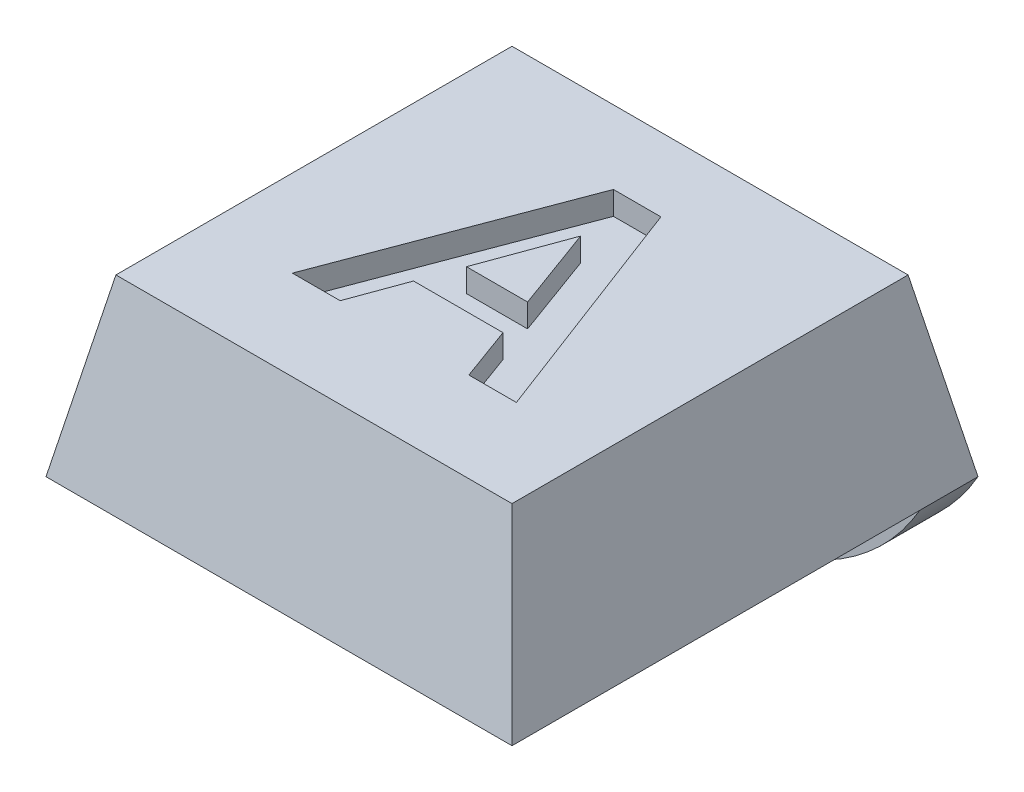
ISO-10303-21;
HEADER;
FILE_DESCRIPTION(('STEP AP214'),'2;1');
FILE_NAME('part.step','',(''),(''),'','','');
FILE_SCHEMA(('AUTOMOTIVE_DESIGN { 1 0 10303 214 1 1 1 1 }'));
ENDSEC;
DATA;
#1=APPLICATION_CONTEXT('core data for automotive mechanical design processes');
#2=APPLICATION_PROTOCOL_DEFINITION('international standard','automotive_design',2000,#1);
#3=PRODUCT_CONTEXT('',#1,'mechanical');
#4=PRODUCT('Part','Part','',(#3));
#5=PRODUCT_RELATED_PRODUCT_CATEGORY('part','',(#4));
#6=PRODUCT_DEFINITION_FORMATION('','',#4);
#7=PRODUCT_DEFINITION_CONTEXT('part definition',#1,'design');
#8=PRODUCT_DEFINITION('design','',#6,#7);
#9=PRODUCT_DEFINITION_SHAPE('','',#8);
#10=(LENGTH_UNIT() NAMED_UNIT(*) SI_UNIT(.MILLI.,.METRE.));
#11=(NAMED_UNIT(*) PLANE_ANGLE_UNIT() SI_UNIT($,.RADIAN.));
#12=(NAMED_UNIT(*) SI_UNIT($,.STERADIAN.) SOLID_ANGLE_UNIT());
#13=UNCERTAINTY_MEASURE_WITH_UNIT(LENGTH_MEASURE(1.E-05),#10,'distance_accuracy_value','');
#14=(GEOMETRIC_REPRESENTATION_CONTEXT(3) GLOBAL_UNCERTAINTY_ASSIGNED_CONTEXT((#13)) GLOBAL_UNIT_ASSIGNED_CONTEXT((#10,
#11,#12)) REPRESENTATION_CONTEXT('',''));
#15=CARTESIAN_POINT('',(0.,0.,0.));
#16=DIRECTION('',(0.,0.,1.));
#17=DIRECTION('',(1.,0.,0.));
#18=AXIS2_PLACEMENT_3D('',#15,#16,#17);
#19=CARTESIAN_POINT('',(0.,3.,0.));
#20=DIRECTION('',(0.,-1.,0.));
#21=DIRECTION('',(0.,0.,-1.));
#22=AXIS2_PLACEMENT_3D('',#19,#20,#21);
#23=PLANE('',#22);
#24=DIRECTION('',(-1.,0.,0.));
#25=VECTOR('',#24,1.);
#26=CARTESIAN_POINT('',(11.,3.,-0.6));
#27=LINE('',#26,#25);
#28=CARTESIAN_POINT('',(7.4,3.,-0.6));
#29=VERTEX_POINT('',#28);
#30=CARTESIAN_POINT('',(0.6,3.,-0.6));
#31=VERTEX_POINT('',#30);
#32=EDGE_CURVE('E314',#29,#31,#27,.T.);
#33=ORIENTED_EDGE('',*,*,#32,.F.);
#34=DIRECTION('',(0.,0.,1.));
#35=VECTOR('',#34,1.);
#36=CARTESIAN_POINT('',(7.4,3.,-8.));
#37=LINE('',#36,#35);
#38=CARTESIAN_POINT('',(7.4,3.,-7.4));
#39=VERTEX_POINT('',#38);
#40=EDGE_CURVE('E327',#39,#29,#37,.T.);
#41=ORIENTED_EDGE('',*,*,#40,.F.);
#42=DIRECTION('',(-1.,0.,0.));
#43=VECTOR('',#42,1.);
#44=CARTESIAN_POINT('',(11.,3.,-7.4));
#45=LINE('',#44,#43);
#46=CARTESIAN_POINT('',(0.599999999999999,3.,-7.4));
#47=VERTEX_POINT('',#46);
#48=EDGE_CURVE('E310',#39,#47,#45,.T.);
#49=ORIENTED_EDGE('',*,*,#48,.T.);
#50=DIRECTION('',(0.,0.,1.));
#51=VECTOR('',#50,1.);
#52=CARTESIAN_POINT('',(0.6,3.,-8.));
#53=LINE('',#52,#51);
#54=EDGE_CURVE('E330',#47,#31,#53,.T.);
#55=ORIENTED_EDGE('',*,*,#54,.T.);
#56=EDGE_LOOP('',(#33,#41,#49,#55));
#57=FACE_BOUND('',#56,.T.);
#58=DIRECTION('',(0.355060662326772,0.,0.934843262835045));
#59=VECTOR('',#58,1.);
#60=CARTESIAN_POINT('',(4.41462653323797,3.,-6.14165206843505));
#61=LINE('',#60,#59);
#62=CARTESIAN_POINT('',(4.41462653323797,3.,-6.14165206843505));
#63=VERTEX_POINT('',#62);
#64=CARTESIAN_POINT('',(5.93385730246874,3.,-2.14165206843505));
#65=VERTEX_POINT('',#64);
#66=EDGE_CURVE('E58',#63,#65,#61,.T.);
#67=ORIENTED_EDGE('',*,*,#66,.T.);
#68=DIRECTION('',(-1.,0.,0.));
#69=VECTOR('',#68,1.);
#70=CARTESIAN_POINT('',(5.93385730246874,3.,-2.14165206843505));
#71=LINE('',#70,#69);
#72=CARTESIAN_POINT('',(5.11815217426361,3.,-2.14165206843505));
#73=VERTEX_POINT('',#72);
#74=EDGE_CURVE('E239',#65,#73,#71,.T.);
#75=ORIENTED_EDGE('',*,*,#74,.T.);
#76=DIRECTION('',(-0.343248282132193,0.,-0.939244705501872));
#77=VECTOR('',#76,1.);
#78=CARTESIAN_POINT('',(5.11815217426361,3.,-2.14165206843505));
#79=LINE('',#78,#77);
#80=CARTESIAN_POINT('',(4.78081243067387,3.,-3.06472899151198));
#81=VERTEX_POINT('',#80);
#82=EDGE_CURVE('E243',#73,#81,#79,.T.);
#83=ORIENTED_EDGE('',*,*,#82,.T.);
#84=DIRECTION('',(-1.,0.,0.));
#85=VECTOR('',#84,1.);
#86=CARTESIAN_POINT('',(4.78081243067387,3.,-3.06472899151198));
#87=LINE('',#86,#85);
#88=CARTESIAN_POINT('',(3.24555602041746,3.,-3.06472899151198));
#89=VERTEX_POINT('',#88);
#90=EDGE_CURVE('E247',#81,#89,#87,.T.);
#91=ORIENTED_EDGE('',*,*,#90,.T.);
#92=DIRECTION('',(-0.343248282132194,0.,0.939244705501872));
#93=VECTOR('',#92,1.);
#94=CARTESIAN_POINT('',(3.24555602041746,3.,-3.06472899151198));
#95=LINE('',#94,#93);
#96=CARTESIAN_POINT('',(2.90821627682771,3.,-2.14165206843505));
#97=VERTEX_POINT('',#96);
#98=EDGE_CURVE('E251',#89,#97,#95,.T.);
#99=ORIENTED_EDGE('',*,*,#98,.T.);
#100=DIRECTION('',(-1.,0.,0.));
#101=VECTOR('',#100,1.);
#102=CARTESIAN_POINT('',(2.90821627682771,3.,-2.14165206843505));
#103=LINE('',#102,#101);
#104=CARTESIAN_POINT('',(2.08770345631489,3.,-2.14165206843505));
#105=VERTEX_POINT('',#104);
#106=EDGE_CURVE('E255',#97,#105,#103,.T.);
#107=ORIENTED_EDGE('',*,*,#106,.T.);
#108=DIRECTION('',(0.353586403368764,0.,-0.935401868371419));
#109=VECTOR('',#108,1.);
#110=CARTESIAN_POINT('',(2.08770345631489,3.,-2.14165206843505));
#111=LINE('',#110,#109);
#112=CARTESIAN_POINT('',(3.59972268708412,3.,-6.14165206843505));
#113=VERTEX_POINT('',#112);
#114=EDGE_CURVE('E259',#105,#113,#111,.T.);
#115=ORIENTED_EDGE('',*,*,#114,.T.);
#116=DIRECTION('',(1.,0.,0.));
#117=VECTOR('',#116,1.);
#118=CARTESIAN_POINT('',(3.59972268708412,3.,-6.14165206843505));
#119=LINE('',#118,#117);
#120=EDGE_CURVE('E215',#113,#63,#119,.T.);
#121=ORIENTED_EDGE('',*,*,#120,.T.);
#122=EDGE_LOOP('',(#67,#75,#83,#91,#99,#107,#115,#121));
#123=FACE_BOUND('',#122,.T.);
#124=ADVANCED_FACE('F42',(#57,#123),#23,.F.);
#125=CARTESIAN_POINT('',(8.,0.,-8.));
#126=DIRECTION('',(-0.98058067569092,-0.196116135138184,0.));
#127=DIRECTION('',(0.196116135138184,-0.98058067569092,0.));
#128=AXIS2_PLACEMENT_3D('',#125,#126,#127);
#129=PLANE('',#128);
#130=DIRECTION('',(-0.192450089729875,0.962250448649376,-0.192450089729875));
#131=VECTOR('',#130,1.);
#132=CARTESIAN_POINT('',(7.7037037037037,1.48148148148148,-0.296296296296296));
#133=LINE('',#132,#131);
#134=CARTESIAN_POINT('',(8.,0.,0.));
#135=VERTEX_POINT('',#134);
#136=EDGE_CURVE('E324',#135,#29,#133,.T.);
#137=ORIENTED_EDGE('',*,*,#136,.F.);
#138=DIRECTION('',(0.,0.,-1.));
#139=VECTOR('',#138,1.);
#140=CARTESIAN_POINT('',(8.,0.,0.));
#141=LINE('',#140,#139);
#142=CARTESIAN_POINT('',(8.,0.,-7.));
#143=VERTEX_POINT('',#142);
#144=EDGE_CURVE('E343',#135,#143,#141,.T.);
#145=ORIENTED_EDGE('',*,*,#144,.T.);
#146=DIRECTION('',(0.,0.,1.));
#147=VECTOR('',#146,1.);
#148=CARTESIAN_POINT('',(8.,0.,-8.));
#149=LINE('',#148,#147);
#150=CARTESIAN_POINT('',(8.,0.,-8.));
#151=VERTEX_POINT('',#150);
#152=EDGE_CURVE('E289',#151,#143,#149,.T.);
#153=ORIENTED_EDGE('',*,*,#152,.F.);
#154=DIRECTION('',(0.192450089729875,-0.962250448649376,-0.192450089729875));
#155=VECTOR('',#154,1.);
#156=CARTESIAN_POINT('',(8.,0.,-8.));
#157=LINE('',#156,#155);
#158=EDGE_CURVE('E317',#39,#151,#157,.T.);
#159=ORIENTED_EDGE('',*,*,#158,.F.);
#160=ORIENTED_EDGE('',*,*,#40,.T.);
#161=EDGE_LOOP('',(#137,#145,#153,#159,#160));
#162=FACE_BOUND('',#161,.T.);
#163=ADVANCED_FACE('F416',(#162),#129,.F.);
#164=CARTESIAN_POINT('',(0.,0.,-8.));
#165=DIRECTION('',(0.98058067569092,-0.196116135138184,0.));
#166=DIRECTION('',(0.196116135138184,0.98058067569092,0.));
#167=AXIS2_PLACEMENT_3D('',#164,#165,#166);
#168=PLANE('',#167);
#169=DIRECTION('',(-0.192450089729875,-0.962250448649376,0.192450089729875));
#170=VECTOR('',#169,1.);
#171=CARTESIAN_POINT('',(0.296296296296296,1.48148148148148,-0.296296296296296));
#172=LINE('',#171,#170);
#173=CARTESIAN_POINT('',(0.,0.,0.));
#174=VERTEX_POINT('',#173);
#175=EDGE_CURVE('E371',#31,#174,#172,.T.);
#176=ORIENTED_EDGE('',*,*,#175,.F.);
#177=ORIENTED_EDGE('',*,*,#54,.F.);
#178=DIRECTION('',(0.192450089729875,0.962250448649376,0.192450089729875));
#179=VECTOR('',#178,1.);
#180=CARTESIAN_POINT('',(0.,0.,-8.));
#181=LINE('',#180,#179);
#182=CARTESIAN_POINT('',(0.,0.,-8.));
#183=VERTEX_POINT('',#182);
#184=EDGE_CURVE('E342',#183,#47,#181,.T.);
#185=ORIENTED_EDGE('',*,*,#184,.F.);
#186=DIRECTION('',(0.,0.,1.));
#187=VECTOR('',#186,1.);
#188=CARTESIAN_POINT('',(0.,0.,0.));
#189=LINE('',#188,#187);
#190=CARTESIAN_POINT('',(0.,0.,-7.));
#191=VERTEX_POINT('',#190);
#192=EDGE_CURVE('E347',#183,#191,#189,.T.);
#193=ORIENTED_EDGE('',*,*,#192,.T.);
#194=EDGE_CURVE('E334',#191,#174,#189,.T.);
#195=ORIENTED_EDGE('',*,*,#194,.T.);
#196=EDGE_LOOP('',(#176,#177,#185,#193,#195));
#197=FACE_BOUND('',#196,.T.);
#198=ADVANCED_FACE('F396',(#197),#168,.F.);
#199=CARTESIAN_POINT('',(0.,0.,0.));
#200=DIRECTION('',(0.,-1.,0.));
#201=DIRECTION('',(0.,0.,-1.));
#202=AXIS2_PLACEMENT_3D('',#199,#200,#201);
#203=PLANE('',#202);
#204=DIRECTION('',(-1.,0.,0.));
#205=VECTOR('',#204,1.);
#206=CARTESIAN_POINT('',(0.,0.,-7.));
#207=LINE('',#206,#205);
#208=EDGE_CURVE('E295',#143,#191,#207,.T.);
#209=ORIENTED_EDGE('',*,*,#208,.F.);
#210=ORIENTED_EDGE('',*,*,#144,.F.);
#211=DIRECTION('',(1.,0.,0.));
#212=VECTOR('',#211,1.);
#213=CARTESIAN_POINT('',(0.,0.,0.));
#214=LINE('',#213,#212);
#215=EDGE_CURVE('E344',#174,#135,#214,.T.);
#216=ORIENTED_EDGE('',*,*,#215,.F.);
#217=ORIENTED_EDGE('',*,*,#194,.F.);
#218=EDGE_LOOP('',(#209,#210,#216,#217));
#219=FACE_BOUND('',#218,.T.);
#220=CARTESIAN_POINT('',(4.,0.,-3.75));
#221=DIRECTION('',(0.,-1.,0.));
#222=DIRECTION('',(0.,0.,-1.));
#223=AXIS2_PLACEMENT_3D('',#220,#221,#222);
#224=CIRCLE('',#223,1.8);
#225=CARTESIAN_POINT('',(4.,0.,-5.55));
#226=VERTEX_POINT('',#225);
#227=EDGE_CURVE('E299',#226,#226,#224,.T.);
#228=ORIENTED_EDGE('',*,*,#227,.F.);
#229=EDGE_LOOP('',(#228));
#230=FACE_BOUND('',#229,.T.);
#231=ADVANCED_FACE('F411',(#219,#230),#203,.T.);
#232=CARTESIAN_POINT('',(11.,3.,-7.4));
#233=DIRECTION('',(0.,0.196116135138184,-0.98058067569092));
#234=DIRECTION('',(0.,0.98058067569092,0.196116135138184));
#235=AXIS2_PLACEMENT_3D('',#232,#233,#234);
#236=PLANE('',#235);
#237=ORIENTED_EDGE('',*,*,#158,.T.);
#238=DIRECTION('',(-1.,0.,0.));
#239=VECTOR('',#238,1.);
#240=CARTESIAN_POINT('',(0.,0.,-8.));
#241=LINE('',#240,#239);
#242=EDGE_CURVE('E338',#151,#183,#241,.T.);
#243=ORIENTED_EDGE('',*,*,#242,.T.);
#244=ORIENTED_EDGE('',*,*,#184,.T.);
#245=ORIENTED_EDGE('',*,*,#48,.F.);
#246=EDGE_LOOP('',(#237,#243,#244,#245));
#247=FACE_BOUND('',#246,.T.);
#248=ADVANCED_FACE('F391',(#247),#236,.T.);
#249=CARTESIAN_POINT('',(11.,0.,0.));
#250=DIRECTION('',(0.,0.196116135138184,0.98058067569092));
#251=DIRECTION('',(0.,-0.98058067569092,0.196116135138184));
#252=AXIS2_PLACEMENT_3D('',#249,#250,#251);
#253=PLANE('',#252);
#254=ORIENTED_EDGE('',*,*,#136,.T.);
#255=ORIENTED_EDGE('',*,*,#32,.T.);
#256=ORIENTED_EDGE('',*,*,#175,.T.);
#257=ORIENTED_EDGE('',*,*,#215,.T.);
#258=EDGE_LOOP('',(#254,#255,#256,#257));
#259=FACE_BOUND('',#258,.T.);
#260=ADVANCED_FACE('F420',(#259),#253,.T.);
#261=CARTESIAN_POINT('',(4.,0.8,-3.75));
#262=DIRECTION('',(0.,-1.,0.));
#263=DIRECTION('',(0.,0.,-1.));
#264=AXIS2_PLACEMENT_3D('',#261,#262,#263);
#265=CYLINDRICAL_SURFACE('',#264,1.8);
#266=CARTESIAN_POINT('',(4.,0.8,-3.75));
#267=DIRECTION('',(0.,-1.,0.));
#268=DIRECTION('',(0.,0.,-1.));
#269=AXIS2_PLACEMENT_3D('',#266,#267,#268);
#270=CIRCLE('',#269,1.8);
#271=CARTESIAN_POINT('',(4.,0.8,-5.55));
#272=VERTEX_POINT('',#271);
#273=EDGE_CURVE('E306',#272,#272,#270,.T.);
#274=ORIENTED_EDGE('',*,*,#273,.F.);
#275=EDGE_LOOP('',(#274));
#276=FACE_BOUND('',#275,.T.);
#277=ORIENTED_EDGE('',*,*,#227,.T.);
#278=EDGE_LOOP('',(#277));
#279=FACE_BOUND('',#278,.T.);
#280=ADVANCED_FACE('F491',(#276,#279),#265,.F.);
#281=CARTESIAN_POINT('',(4.,0.8,-3.75));
#282=DIRECTION('',(0.,-1.,0.));
#283=DIRECTION('',(0.,0.,-1.));
#284=AXIS2_PLACEMENT_3D('',#281,#282,#283);
#285=PLANE('',#284);
#286=ORIENTED_EDGE('',*,*,#273,.T.);
#287=EDGE_LOOP('',(#286));
#288=FACE_BOUND('',#287,.T.);
#289=ADVANCED_FACE('F488',(#288),#285,.T.);
#290=CARTESIAN_POINT('',(0.,-2.,-8.));
#291=DIRECTION('',(0.,0.,1.));
#292=DIRECTION('',(1.,0.,0.));
#293=AXIS2_PLACEMENT_3D('',#290,#291,#292);
#294=PLANE('',#293);
#295=ORIENTED_EDGE('',*,*,#242,.F.);
#296=CARTESIAN_POINT('',(4.53589838486225,2.,-8.));
#297=DIRECTION('',(0.,0.,1.));
#298=DIRECTION('',(1.,0.,0.));
#299=AXIS2_PLACEMENT_3D('',#296,#297,#298);
#300=CIRCLE('',#299,4.);
#301=CARTESIAN_POINT('',(4.53589838486225,-2.,-8.));
#302=VERTEX_POINT('',#301);
#303=EDGE_CURVE('E11',#151,#302,#300,.F.);
#304=ORIENTED_EDGE('',*,*,#303,.T.);
#305=DIRECTION('',(1.,0.,0.));
#306=VECTOR('',#305,1.);
#307=CARTESIAN_POINT('',(0.,-2.,-8.));
#308=LINE('',#307,#306);
#309=CARTESIAN_POINT('',(3.46410161513775,-2.,-8.));
#310=VERTEX_POINT('',#309);
#311=EDGE_CURVE('E290',#310,#302,#308,.T.);
#312=ORIENTED_EDGE('',*,*,#311,.F.);
#313=CARTESIAN_POINT('',(3.46410161513775,2.,-8.));
#314=DIRECTION('',(0.,0.,1.));
#315=DIRECTION('',(1.,0.,0.));
#316=AXIS2_PLACEMENT_3D('',#313,#314,#315);
#317=CIRCLE('',#316,4.);
#318=EDGE_CURVE('E51',#310,#183,#317,.F.);
#319=ORIENTED_EDGE('',*,*,#318,.T.);
#320=EDGE_LOOP('',(#295,#304,#312,#319));
#321=FACE_BOUND('',#320,.T.);
#322=ADVANCED_FACE('F384',(#321),#294,.F.);
#323=CARTESIAN_POINT('',(0.,-2.,-7.));
#324=DIRECTION('',(0.,0.,-1.));
#325=DIRECTION('',(-1.,0.,0.));
#326=AXIS2_PLACEMENT_3D('',#323,#324,#325);
#327=PLANE('',#326);
#328=DIRECTION('',(-1.,0.,0.));
#329=VECTOR('',#328,1.);
#330=CARTESIAN_POINT('',(0.,-2.,-7.));
#331=LINE('',#330,#329);
#332=CARTESIAN_POINT('',(4.53589838486225,-2.,-7.));
#333=VERTEX_POINT('',#332);
#334=CARTESIAN_POINT('',(3.46410161513775,-2.,-7.));
#335=VERTEX_POINT('',#334);
#336=EDGE_CURVE('E294',#333,#335,#331,.T.);
#337=ORIENTED_EDGE('',*,*,#336,.F.);
#338=CARTESIAN_POINT('',(4.53589838486225,2.,-7.));
#339=DIRECTION('',(0.,0.,-1.));
#340=DIRECTION('',(-1.,0.,0.));
#341=AXIS2_PLACEMENT_3D('',#338,#339,#340);
#342=CIRCLE('',#341,4.);
#343=EDGE_CURVE('E378',#333,#143,#342,.F.);
#344=ORIENTED_EDGE('',*,*,#343,.T.);
#345=ORIENTED_EDGE('',*,*,#208,.T.);
#346=CARTESIAN_POINT('',(3.46410161513775,2.,-7.));
#347=DIRECTION('',(0.,0.,-1.));
#348=DIRECTION('',(-1.,0.,0.));
#349=AXIS2_PLACEMENT_3D('',#346,#347,#348);
#350=CIRCLE('',#349,4.);
#351=EDGE_CURVE('E375',#191,#335,#350,.F.);
#352=ORIENTED_EDGE('',*,*,#351,.T.);
#353=EDGE_LOOP('',(#337,#344,#345,#352));
#354=FACE_BOUND('',#353,.T.);
#355=ADVANCED_FACE('F402',(#354),#327,.F.);
#356=CARTESIAN_POINT('',(0.,-2.,0.));
#357=DIRECTION('',(0.,1.,0.));
#358=DIRECTION('',(0.,0.,1.));
#359=AXIS2_PLACEMENT_3D('',#356,#357,#358);
#360=PLANE('',#359);
#361=ORIENTED_EDGE('',*,*,#311,.T.);
#362=DIRECTION('',(0.,0.,1.));
#363=VECTOR('',#362,1.);
#364=CARTESIAN_POINT('',(4.53589838486225,-2.,0.));
#365=LINE('',#364,#363);
#366=EDGE_CURVE('E370',#302,#333,#365,.T.);
#367=ORIENTED_EDGE('',*,*,#366,.T.);
#368=ORIENTED_EDGE('',*,*,#336,.T.);
#369=DIRECTION('',(0.,0.,-1.));
#370=VECTOR('',#369,1.);
#371=CARTESIAN_POINT('',(3.46410161513775,-2.,0.));
#372=LINE('',#371,#370);
#373=EDGE_CURVE('E366',#335,#310,#372,.T.);
#374=ORIENTED_EDGE('',*,*,#373,.T.);
#375=EDGE_LOOP('',(#361,#367,#368,#374));
#376=FACE_BOUND('',#375,.T.);
#377=ADVANCED_FACE('F405',(#376),#360,.F.);
#378=CARTESIAN_POINT('',(4.53589838486225,2.,-8.));
#379=DIRECTION('',(0.,0.,1.));
#380=DIRECTION('',(1.,0.,0.));
#381=AXIS2_PLACEMENT_3D('',#378,#379,#380);
#382=CYLINDRICAL_SURFACE('',#381,4.);
#383=ORIENTED_EDGE('',*,*,#303,.F.);
#384=ORIENTED_EDGE('',*,*,#152,.T.);
#385=ORIENTED_EDGE('',*,*,#343,.F.);
#386=ORIENTED_EDGE('',*,*,#366,.F.);
#387=EDGE_LOOP('',(#383,#384,#385,#386));
#388=FACE_BOUND('',#387,.T.);
#389=ADVANCED_FACE('F408',(#388),#382,.T.);
#390=CARTESIAN_POINT('',(3.46410161513775,2.,-8.));
#391=DIRECTION('',(0.,0.,-1.));
#392=DIRECTION('',(-1.,0.,0.));
#393=AXIS2_PLACEMENT_3D('',#390,#391,#392);
#394=CYLINDRICAL_SURFACE('',#393,4.);
#395=ORIENTED_EDGE('',*,*,#351,.F.);
#396=ORIENTED_EDGE('',*,*,#192,.F.);
#397=ORIENTED_EDGE('',*,*,#318,.F.);
#398=ORIENTED_EDGE('',*,*,#373,.F.);
#399=EDGE_LOOP('',(#395,#396,#397,#398));
#400=FACE_BOUND('',#399,.T.);
#401=ADVANCED_FACE('F44',(#400),#394,.T.);
#402=CARTESIAN_POINT('',(4.41462653323797,2.6,-6.14165206843505));
#403=DIRECTION('',(-0.934843262835046,0.,0.355060662326772));
#404=DIRECTION('',(0.355060662326772,0.,0.934843262835046));
#405=AXIS2_PLACEMENT_3D('',#402,#403,#404);
#406=PLANE('',#405);
#407=ORIENTED_EDGE('',*,*,#66,.F.);
#408=DIRECTION('',(0.,1.,0.));
#409=VECTOR('',#408,1.);
#410=CARTESIAN_POINT('',(4.41462653323797,2.6,-6.14165206843505));
#411=LINE('',#410,#409);
#412=CARTESIAN_POINT('',(4.41462653323797,2.6,-6.14165206843505));
#413=VERTEX_POINT('',#412);
#414=EDGE_CURVE('E236',#413,#63,#411,.T.);
#415=ORIENTED_EDGE('',*,*,#414,.F.);
#416=DIRECTION('',(0.355060662326772,0.,0.934843262835045));
#417=VECTOR('',#416,1.);
#418=CARTESIAN_POINT('',(4.41462653323797,2.6,-6.14165206843505));
#419=LINE('',#418,#417);
#420=CARTESIAN_POINT('',(5.93385730246874,2.6,-2.14165206843505));
#421=VERTEX_POINT('',#420);
#422=EDGE_CURVE('E210',#413,#421,#419,.T.);
#423=ORIENTED_EDGE('',*,*,#422,.T.);
#424=DIRECTION('',(0.,1.,0.));
#425=VECTOR('',#424,1.);
#426=CARTESIAN_POINT('',(5.93385730246874,2.6,-2.14165206843505));
#427=LINE('',#426,#425);
#428=EDGE_CURVE('E286',#421,#65,#427,.T.);
#429=ORIENTED_EDGE('',*,*,#428,.T.);
#430=EDGE_LOOP('',(#407,#415,#423,#429));
#431=FACE_BOUND('',#430,.T.);
#432=ADVANCED_FACE('F434',(#431),#406,.T.);
#433=CARTESIAN_POINT('',(5.93385730246874,2.6,-2.14165206843505));
#434=DIRECTION('',(0.,0.,-1.));
#435=DIRECTION('',(-1.,0.,0.));
#436=AXIS2_PLACEMENT_3D('',#433,#434,#435);
#437=PLANE('',#436);
#438=ORIENTED_EDGE('',*,*,#74,.F.);
#439=ORIENTED_EDGE('',*,*,#428,.F.);
#440=DIRECTION('',(-1.,0.,0.));
#441=VECTOR('',#440,1.);
#442=CARTESIAN_POINT('',(5.93385730246874,2.6,-2.14165206843505));
#443=LINE('',#442,#441);
#444=CARTESIAN_POINT('',(5.11815217426361,2.6,-2.14165206843505));
#445=VERTEX_POINT('',#444);
#446=EDGE_CURVE('E214',#421,#445,#443,.T.);
#447=ORIENTED_EDGE('',*,*,#446,.T.);
#448=DIRECTION('',(0.,1.,0.));
#449=VECTOR('',#448,1.);
#450=CARTESIAN_POINT('',(5.11815217426361,2.6,-2.14165206843505));
#451=LINE('',#450,#449);
#452=EDGE_CURVE('E283',#445,#73,#451,.T.);
#453=ORIENTED_EDGE('',*,*,#452,.T.);
#454=EDGE_LOOP('',(#438,#439,#447,#453));
#455=FACE_BOUND('',#454,.T.);
#456=ADVANCED_FACE('F441',(#455),#437,.T.);
#457=CARTESIAN_POINT('',(5.11815217426361,2.6,-2.14165206843505));
#458=DIRECTION('',(0.939244705501872,0.,-0.343248282132193));
#459=DIRECTION('',(-0.343248282132193,0.,-0.939244705501872));
#460=AXIS2_PLACEMENT_3D('',#457,#458,#459);
#461=PLANE('',#460);
#462=ORIENTED_EDGE('',*,*,#82,.F.);
#463=ORIENTED_EDGE('',*,*,#452,.F.);
#464=DIRECTION('',(-0.343248282132193,0.,-0.939244705501872));
#465=VECTOR('',#464,1.);
#466=CARTESIAN_POINT('',(5.11815217426361,2.6,-2.14165206843505));
#467=LINE('',#466,#465);
#468=CARTESIAN_POINT('',(4.78081243067387,2.6,-3.06472899151198));
#469=VERTEX_POINT('',#468);
#470=EDGE_CURVE('E218',#445,#469,#467,.T.);
#471=ORIENTED_EDGE('',*,*,#470,.T.);
#472=DIRECTION('',(0.,1.,0.));
#473=VECTOR('',#472,1.);
#474=CARTESIAN_POINT('',(4.78081243067387,2.6,-3.06472899151198));
#475=LINE('',#474,#473);
#476=EDGE_CURVE('E280',#469,#81,#475,.T.);
#477=ORIENTED_EDGE('',*,*,#476,.T.);
#478=EDGE_LOOP('',(#462,#463,#471,#477));
#479=FACE_BOUND('',#478,.T.);
#480=ADVANCED_FACE('F444',(#479),#461,.T.);
#481=CARTESIAN_POINT('',(4.78081243067387,2.6,-3.06472899151198));
#482=DIRECTION('',(0.,0.,-1.));
#483=DIRECTION('',(-1.,0.,0.));
#484=AXIS2_PLACEMENT_3D('',#481,#482,#483);
#485=PLANE('',#484);
#486=ORIENTED_EDGE('',*,*,#90,.F.);
#487=ORIENTED_EDGE('',*,*,#476,.F.);
#488=DIRECTION('',(-1.,0.,0.));
#489=VECTOR('',#488,1.);
#490=CARTESIAN_POINT('',(4.78081243067387,2.6,-3.06472899151198));
#491=LINE('',#490,#489);
#492=CARTESIAN_POINT('',(3.24555602041746,2.6,-3.06472899151198));
#493=VERTEX_POINT('',#492);
#494=EDGE_CURVE('E221',#469,#493,#491,.T.);
#495=ORIENTED_EDGE('',*,*,#494,.T.);
#496=DIRECTION('',(0.,1.,0.));
#497=VECTOR('',#496,1.);
#498=CARTESIAN_POINT('',(3.24555602041746,2.6,-3.06472899151198));
#499=LINE('',#498,#497);
#500=EDGE_CURVE('E277',#493,#89,#499,.T.);
#501=ORIENTED_EDGE('',*,*,#500,.T.);
#502=EDGE_LOOP('',(#486,#487,#495,#501));
#503=FACE_BOUND('',#502,.T.);
#504=ADVANCED_FACE('F449',(#503),#485,.T.);
#505=CARTESIAN_POINT('',(3.24555602041746,2.6,-3.06472899151198));
#506=DIRECTION('',(-0.939244705501871,0.,-0.343248282132194));
#507=DIRECTION('',(-0.343248282132194,0.,0.939244705501872));
#508=AXIS2_PLACEMENT_3D('',#505,#506,#507);
#509=PLANE('',#508);
#510=ORIENTED_EDGE('',*,*,#98,.F.);
#511=ORIENTED_EDGE('',*,*,#500,.F.);
#512=DIRECTION('',(-0.343248282132194,0.,0.939244705501872));
#513=VECTOR('',#512,1.);
#514=CARTESIAN_POINT('',(3.24555602041746,2.6,-3.06472899151198));
#515=LINE('',#514,#513);
#516=CARTESIAN_POINT('',(2.90821627682771,2.6,-2.14165206843505));
#517=VERTEX_POINT('',#516);
#518=EDGE_CURVE('E224',#493,#517,#515,.T.);
#519=ORIENTED_EDGE('',*,*,#518,.T.);
#520=DIRECTION('',(0.,1.,0.));
#521=VECTOR('',#520,1.);
#522=CARTESIAN_POINT('',(2.90821627682771,2.6,-2.14165206843505));
#523=LINE('',#522,#521);
#524=EDGE_CURVE('E274',#517,#97,#523,.T.);
#525=ORIENTED_EDGE('',*,*,#524,.T.);
#526=EDGE_LOOP('',(#510,#511,#519,#525));
#527=FACE_BOUND('',#526,.T.);
#528=ADVANCED_FACE('F453',(#527),#509,.T.);
#529=CARTESIAN_POINT('',(2.90821627682771,2.6,-2.14165206843505));
#530=DIRECTION('',(0.,0.,-1.));
#531=DIRECTION('',(-1.,0.,0.));
#532=AXIS2_PLACEMENT_3D('',#529,#530,#531);
#533=PLANE('',#532);
#534=ORIENTED_EDGE('',*,*,#106,.F.);
#535=ORIENTED_EDGE('',*,*,#524,.F.);
#536=DIRECTION('',(-1.,0.,0.));
#537=VECTOR('',#536,1.);
#538=CARTESIAN_POINT('',(2.90821627682771,2.6,-2.14165206843505));
#539=LINE('',#538,#537);
#540=CARTESIAN_POINT('',(2.08770345631489,2.6,-2.14165206843505));
#541=VERTEX_POINT('',#540);
#542=EDGE_CURVE('E227',#517,#541,#539,.T.);
#543=ORIENTED_EDGE('',*,*,#542,.T.);
#544=DIRECTION('',(0.,1.,0.));
#545=VECTOR('',#544,1.);
#546=CARTESIAN_POINT('',(2.08770345631489,2.6,-2.14165206843505));
#547=LINE('',#546,#545);
#548=EDGE_CURVE('E271',#541,#105,#547,.T.);
#549=ORIENTED_EDGE('',*,*,#548,.T.);
#550=EDGE_LOOP('',(#534,#535,#543,#549));
#551=FACE_BOUND('',#550,.T.);
#552=ADVANCED_FACE('F458',(#551),#533,.T.);
#553=CARTESIAN_POINT('',(2.08770345631489,2.6,-2.14165206843505));
#554=DIRECTION('',(0.935401868371419,0.,0.353586403368764));
#555=DIRECTION('',(0.353586403368764,0.,-0.935401868371419));
#556=AXIS2_PLACEMENT_3D('',#553,#554,#555);
#557=PLANE('',#556);
#558=ORIENTED_EDGE('',*,*,#114,.F.);
#559=ORIENTED_EDGE('',*,*,#548,.F.);
#560=DIRECTION('',(0.353586403368764,0.,-0.935401868371419));
#561=VECTOR('',#560,1.);
#562=CARTESIAN_POINT('',(2.08770345631489,2.6,-2.14165206843505));
#563=LINE('',#562,#561);
#564=CARTESIAN_POINT('',(3.59972268708412,2.6,-6.14165206843505));
#565=VERTEX_POINT('',#564);
#566=EDGE_CURVE('E230',#541,#565,#563,.T.);
#567=ORIENTED_EDGE('',*,*,#566,.T.);
#568=DIRECTION('',(0.,1.,0.));
#569=VECTOR('',#568,1.);
#570=CARTESIAN_POINT('',(3.59972268708412,2.6,-6.14165206843505));
#571=LINE('',#570,#569);
#572=EDGE_CURVE('E268',#565,#113,#571,.T.);
#573=ORIENTED_EDGE('',*,*,#572,.T.);
#574=EDGE_LOOP('',(#558,#559,#567,#573));
#575=FACE_BOUND('',#574,.T.);
#576=ADVANCED_FACE('F461',(#575),#557,.T.);
#577=CARTESIAN_POINT('',(3.59972268708412,2.6,-6.14165206843505));
#578=DIRECTION('',(0.,0.,1.));
#579=DIRECTION('',(1.,0.,0.));
#580=AXIS2_PLACEMENT_3D('',#577,#578,#579);
#581=PLANE('',#580);
#582=ORIENTED_EDGE('',*,*,#120,.F.);
#583=ORIENTED_EDGE('',*,*,#572,.F.);
#584=DIRECTION('',(1.,0.,0.));
#585=VECTOR('',#584,1.);
#586=CARTESIAN_POINT('',(3.59972268708412,2.6,-6.14165206843505));
#587=LINE('',#586,#585);
#588=EDGE_CURVE('E233',#565,#413,#587,.T.);
#589=ORIENTED_EDGE('',*,*,#588,.T.);
#590=ORIENTED_EDGE('',*,*,#414,.T.);
#591=EDGE_LOOP('',(#582,#583,#589,#590));
#592=FACE_BOUND('',#591,.T.);
#593=ADVANCED_FACE('F431',(#592),#581,.T.);
#594=CARTESIAN_POINT('',(0.,2.6,0.));
#595=DIRECTION('',(0.,-1.,0.));
#596=DIRECTION('',(0.,0.,-1.));
#597=AXIS2_PLACEMENT_3D('',#594,#595,#596);
#598=PLANE('',#597);
#599=DIRECTION('',(1.,0.,0.));
#600=VECTOR('',#599,1.);
#601=CARTESIAN_POINT('',(3.48674191785335,2.6,-3.73139565817864));
#602=LINE('',#601,#600);
#603=CARTESIAN_POINT('',(3.48674191785335,2.6,-3.73139565817864));
#604=VERTEX_POINT('',#603);
#605=CARTESIAN_POINT('',(4.53642140503284,2.6,-3.73139565817864));
#606=VERTEX_POINT('',#605);
#607=EDGE_CURVE('E188',#604,#606,#602,.T.);
#608=ORIENTED_EDGE('',*,*,#607,.F.);
#609=DIRECTION('',(-0.342837179853215,0.,0.939394841432661));
#610=VECTOR('',#609,1.);
#611=CARTESIAN_POINT('',(4.01078037939182,2.6,-5.16729309407608));
#612=LINE('',#611,#610);
#613=CARTESIAN_POINT('',(4.01078037939182,2.6,-5.16729309407608));
#614=VERTEX_POINT('',#613);
#615=EDGE_CURVE('E182',#614,#604,#612,.T.);
#616=ORIENTED_EDGE('',*,*,#615,.F.);
#617=DIRECTION('',(-0.343761882683262,0.,-0.939056850256713));
#618=VECTOR('',#617,1.);
#619=CARTESIAN_POINT('',(4.53642140503284,2.6,-3.73139565817864));
#620=LINE('',#619,#618);
#621=EDGE_CURVE('E173',#606,#614,#620,.T.);
#622=ORIENTED_EDGE('',*,*,#621,.F.);
#623=EDGE_LOOP('',(#608,#616,#622));
#624=FACE_BOUND('',#623,.T.);
#625=ORIENTED_EDGE('',*,*,#422,.F.);
#626=ORIENTED_EDGE('',*,*,#588,.F.);
#627=ORIENTED_EDGE('',*,*,#566,.F.);
#628=ORIENTED_EDGE('',*,*,#542,.F.);
#629=ORIENTED_EDGE('',*,*,#518,.F.);
#630=ORIENTED_EDGE('',*,*,#494,.F.);
#631=ORIENTED_EDGE('',*,*,#470,.F.);
#632=ORIENTED_EDGE('',*,*,#446,.F.);
#633=EDGE_LOOP('',(#625,#626,#627,#628,#629,#630,#631,#632));
#634=FACE_BOUND('',#633,.T.);
#635=ADVANCED_FACE('F186',(#624,#634),#598,.F.);
#636=CARTESIAN_POINT('',(3.48674191785335,2.6,-3.73139565817864));
#637=DIRECTION('',(0.,0.,1.));
#638=DIRECTION('',(1.,0.,0.));
#639=AXIS2_PLACEMENT_3D('',#636,#637,#638);
#640=PLANE('',#639);
#641=DIRECTION('',(1.,0.,0.));
#642=VECTOR('',#641,1.);
#643=CARTESIAN_POINT('',(3.48674191785335,3.,-3.73139565817864));
#644=LINE('',#643,#642);
#645=CARTESIAN_POINT('',(3.48674191785335,3.,-3.73139565817864));
#646=VERTEX_POINT('',#645);
#647=CARTESIAN_POINT('',(4.53642140503284,3.,-3.73139565817864));
#648=VERTEX_POINT('',#647);
#649=EDGE_CURVE('E201',#646,#648,#644,.T.);
#650=ORIENTED_EDGE('',*,*,#649,.F.);
#651=DIRECTION('',(0.,1.,0.));
#652=VECTOR('',#651,1.);
#653=CARTESIAN_POINT('',(3.48674191785335,2.6,-3.73139565817864));
#654=LINE('',#653,#652);
#655=EDGE_CURVE('E193',#604,#646,#654,.T.);
#656=ORIENTED_EDGE('',*,*,#655,.F.);
#657=ORIENTED_EDGE('',*,*,#607,.T.);
#658=DIRECTION('',(0.,1.,0.));
#659=VECTOR('',#658,1.);
#660=CARTESIAN_POINT('',(4.53642140503284,2.6,-3.73139565817864));
#661=LINE('',#660,#659);
#662=EDGE_CURVE('E170',#606,#648,#661,.T.);
#663=ORIENTED_EDGE('',*,*,#662,.T.);
#664=EDGE_LOOP('',(#650,#656,#657,#663));
#665=FACE_BOUND('',#664,.T.);
#666=ADVANCED_FACE('F192',(#665),#640,.T.);
#667=CARTESIAN_POINT('',(4.01078037939182,2.6,-5.16729309407608));
#668=DIRECTION('',(-0.939394841432661,0.,-0.342837179853215));
#669=DIRECTION('',(-0.342837179853215,0.,0.939394841432661));
#670=AXIS2_PLACEMENT_3D('',#667,#668,#669);
#671=PLANE('',#670);
#672=DIRECTION('',(-0.342837179853215,0.,0.939394841432661));
#673=VECTOR('',#672,1.);
#674=CARTESIAN_POINT('',(4.01078037939182,3.,-5.16729309407608));
#675=LINE('',#674,#673);
#676=CARTESIAN_POINT('',(4.01078037939182,3.,-5.16729309407608));
#677=VERTEX_POINT('',#676);
#678=EDGE_CURVE('E66',#677,#646,#675,.T.);
#679=ORIENTED_EDGE('',*,*,#678,.F.);
#680=DIRECTION('',(0.,1.,0.));
#681=VECTOR('',#680,1.);
#682=CARTESIAN_POINT('',(4.01078037939182,2.6,-5.16729309407608));
#683=LINE('',#682,#681);
#684=EDGE_CURVE('E181',#614,#677,#683,.T.);
#685=ORIENTED_EDGE('',*,*,#684,.F.);
#686=ORIENTED_EDGE('',*,*,#615,.T.);
#687=ORIENTED_EDGE('',*,*,#655,.T.);
#688=EDGE_LOOP('',(#679,#685,#686,#687));
#689=FACE_BOUND('',#688,.T.);
#690=ADVANCED_FACE('F579',(#689),#671,.T.);
#691=CARTESIAN_POINT('',(4.53642140503284,2.6,-3.73139565817864));
#692=DIRECTION('',(0.939056850256713,0.,-0.343761882683262));
#693=DIRECTION('',(-0.343761882683262,0.,-0.939056850256713));
#694=AXIS2_PLACEMENT_3D('',#691,#692,#693);
#695=PLANE('',#694);
#696=DIRECTION('',(-0.343761882683262,0.,-0.939056850256713));
#697=VECTOR('',#696,1.);
#698=CARTESIAN_POINT('',(4.53642140503284,3.,-3.73139565817864));
#699=LINE('',#698,#697);
#700=EDGE_CURVE('E175',#648,#677,#699,.T.);
#701=ORIENTED_EDGE('',*,*,#700,.F.);
#702=ORIENTED_EDGE('',*,*,#662,.F.);
#703=ORIENTED_EDGE('',*,*,#621,.T.);
#704=ORIENTED_EDGE('',*,*,#684,.T.);
#705=EDGE_LOOP('',(#701,#702,#703,#704));
#706=FACE_BOUND('',#705,.T.);
#707=ADVANCED_FACE('F172',(#706),#695,.T.);
#708=ORIENTED_EDGE('',*,*,#649,.T.);
#709=ORIENTED_EDGE('',*,*,#700,.T.);
#710=ORIENTED_EDGE('',*,*,#678,.T.);
#711=EDGE_LOOP('',(#708,#709,#710));
#712=FACE_BOUND('',#711,.T.);
#713=ADVANCED_FACE('F426',(#712),#23,.F.);
#714=CLOSED_SHELL('',(#124,#163,#198,#231,#248,#260,#280,#289,#322,#355,#377,#389,#401,#432,
#456,#480,#504,#528,#552,#576,#593,#635,#666,#690,#707,#713));
#715=MANIFOLD_SOLID_BREP('B2',#714);
#716=ADVANCED_BREP_SHAPE_REPRESENTATION('',(#18,#715),#14);
#717=SHAPE_DEFINITION_REPRESENTATION(#9,#716);
ENDSEC;
END-ISO-10303-21;
